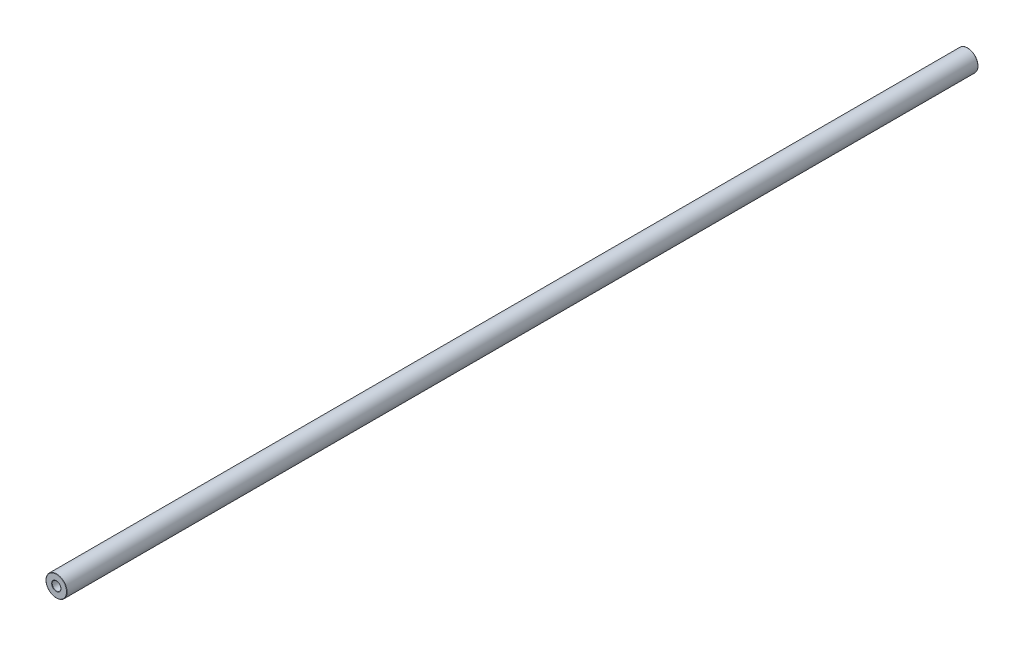
ISO-10303-21;
HEADER;
FILE_DESCRIPTION(('STEP AP214'),'2;1');
FILE_NAME('part.step','',(''),(''),'','','');
FILE_SCHEMA(('AUTOMOTIVE_DESIGN { 1 0 10303 214 1 1 1 1 }'));
ENDSEC;
DATA;
#1=APPLICATION_CONTEXT('core data for automotive mechanical design processes');
#2=APPLICATION_PROTOCOL_DEFINITION('international standard','automotive_design',2000,#1);
#3=PRODUCT_CONTEXT('',#1,'mechanical');
#4=PRODUCT('Part','Part','',(#3));
#5=PRODUCT_RELATED_PRODUCT_CATEGORY('part','',(#4));
#6=PRODUCT_DEFINITION_FORMATION('','',#4);
#7=PRODUCT_DEFINITION_CONTEXT('part definition',#1,'design');
#8=PRODUCT_DEFINITION('design','',#6,#7);
#9=PRODUCT_DEFINITION_SHAPE('','',#8);
#10=(LENGTH_UNIT() NAMED_UNIT(*) SI_UNIT(.MILLI.,.METRE.));
#11=(NAMED_UNIT(*) PLANE_ANGLE_UNIT() SI_UNIT($,.RADIAN.));
#12=(NAMED_UNIT(*) SI_UNIT($,.STERADIAN.) SOLID_ANGLE_UNIT());
#13=UNCERTAINTY_MEASURE_WITH_UNIT(LENGTH_MEASURE(1.E-05),#10,'distance_accuracy_value','');
#14=(GEOMETRIC_REPRESENTATION_CONTEXT(3) GLOBAL_UNCERTAINTY_ASSIGNED_CONTEXT((#13)) GLOBAL_UNIT_ASSIGNED_CONTEXT((#10,
#11,#12)) REPRESENTATION_CONTEXT('',''));
#15=CARTESIAN_POINT('',(0.,0.,0.));
#16=DIRECTION('',(0.,0.,1.));
#17=DIRECTION('',(1.,0.,0.));
#18=AXIS2_PLACEMENT_3D('',#15,#16,#17);
#19=CARTESIAN_POINT('',(0.,0.,260.));
#20=DIRECTION('',(0.,0.,-1.));
#21=DIRECTION('',(-1.,0.,0.));
#22=AXIS2_PLACEMENT_3D('',#19,#20,#21);
#23=CYLINDRICAL_SURFACE('',#22,3.);
#24=CARTESIAN_POINT('',(0.,0.,259.9));
#25=DIRECTION('',(0.,0.,1.));
#26=DIRECTION('',(1.,0.,0.));
#27=AXIS2_PLACEMENT_3D('',#24,#25,#26);
#28=CIRCLE('',#27,3.);
#29=CARTESIAN_POINT('',(3.,0.,259.9));
#30=VERTEX_POINT('',#29);
#31=EDGE_CURVE('E10',#30,#30,#28,.F.);
#32=ORIENTED_EDGE('',*,*,#31,.T.);
#33=EDGE_LOOP('',(#32));
#34=FACE_BOUND('',#33,.T.);
#35=CARTESIAN_POINT('',(0.,0.,0.099999999999989));
#36=DIRECTION('',(0.,0.,1.));
#37=DIRECTION('',(1.,0.,0.));
#38=AXIS2_PLACEMENT_3D('',#35,#36,#37);
#39=CIRCLE('',#38,3.);
#40=CARTESIAN_POINT('',(3.,0.,0.099999999999989));
#41=VERTEX_POINT('',#40);
#42=EDGE_CURVE('E30',#41,#41,#39,.T.);
#43=ORIENTED_EDGE('',*,*,#42,.T.);
#44=EDGE_LOOP('',(#43));
#45=FACE_BOUND('',#44,.T.);
#46=ADVANCED_FACE('F24',(#34,#45),#23,.T.);
#47=CARTESIAN_POINT('',(0.,0.,260.));
#48=DIRECTION('',(0.,0.,1.));
#49=DIRECTION('',(1.,0.,0.));
#50=AXIS2_PLACEMENT_3D('',#47,#48,#49);
#51=PLANE('',#50);
#52=CARTESIAN_POINT('',(0.,0.,260.));
#53=DIRECTION('',(0.,0.,1.));
#54=DIRECTION('',(1.,0.,0.));
#55=AXIS2_PLACEMENT_3D('',#52,#53,#54);
#56=CIRCLE('',#55,1.35);
#57=CARTESIAN_POINT('',(1.35,0.,260.));
#58=VERTEX_POINT('',#57);
#59=EDGE_CURVE('E46',#58,#58,#56,.F.);
#60=ORIENTED_EDGE('',*,*,#59,.T.);
#61=EDGE_LOOP('',(#60));
#62=FACE_BOUND('',#61,.T.);
#63=CARTESIAN_POINT('',(0.,0.,260.));
#64=DIRECTION('',(0.,0.,1.));
#65=DIRECTION('',(1.,0.,0.));
#66=AXIS2_PLACEMENT_3D('',#63,#64,#65);
#67=CIRCLE('',#66,2.9);
#68=CARTESIAN_POINT('',(2.9,0.,260.));
#69=VERTEX_POINT('',#68);
#70=EDGE_CURVE('E49',#69,#69,#67,.T.);
#71=ORIENTED_EDGE('',*,*,#70,.T.);
#72=EDGE_LOOP('',(#71));
#73=FACE_BOUND('',#72,.T.);
#74=ADVANCED_FACE('F81',(#62,#73),#51,.T.);
#75=CARTESIAN_POINT('',(0.,0.,0.));
#76=DIRECTION('',(0.,0.,1.));
#77=DIRECTION('',(1.,0.,0.));
#78=AXIS2_PLACEMENT_3D('',#75,#76,#77);
#79=PLANE('',#78);
#80=CARTESIAN_POINT('',(0.,0.,0.));
#81=DIRECTION('',(0.,0.,1.));
#82=DIRECTION('',(1.,0.,0.));
#83=AXIS2_PLACEMENT_3D('',#80,#81,#82);
#84=CIRCLE('',#83,1.35);
#85=CARTESIAN_POINT('',(1.35,0.,0.));
#86=VERTEX_POINT('',#85);
#87=EDGE_CURVE('E34',#86,#86,#84,.T.);
#88=ORIENTED_EDGE('',*,*,#87,.T.);
#89=EDGE_LOOP('',(#88));
#90=FACE_BOUND('',#89,.T.);
#91=CARTESIAN_POINT('',(0.,0.,0.));
#92=DIRECTION('',(0.,0.,1.));
#93=DIRECTION('',(1.,0.,0.));
#94=AXIS2_PLACEMENT_3D('',#91,#92,#93);
#95=CIRCLE('',#94,2.9);
#96=CARTESIAN_POINT('',(2.9,0.,0.));
#97=VERTEX_POINT('',#96);
#98=EDGE_CURVE('E38',#97,#97,#95,.F.);
#99=ORIENTED_EDGE('',*,*,#98,.T.);
#100=EDGE_LOOP('',(#99));
#101=FACE_BOUND('',#100,.T.);
#102=ADVANCED_FACE('F85',(#90,#101),#79,.F.);
#103=CARTESIAN_POINT('',(0.,0.,240.));
#104=DIRECTION('',(0.,0.,1.));
#105=DIRECTION('',(1.,0.,0.));
#106=AXIS2_PLACEMENT_3D('',#103,#104,#105);
#107=CYLINDRICAL_SURFACE('',#106,1.25);
#108=CARTESIAN_POINT('',(0.,0.,259.9));
#109=DIRECTION('',(0.,0.,1.));
#110=DIRECTION('',(1.,0.,0.));
#111=AXIS2_PLACEMENT_3D('',#108,#109,#110);
#112=CIRCLE('',#111,1.25);
#113=CARTESIAN_POINT('',(1.25,0.,259.9));
#114=VERTEX_POINT('',#113);
#115=EDGE_CURVE('E52',#114,#114,#112,.T.);
#116=ORIENTED_EDGE('',*,*,#115,.T.);
#117=EDGE_LOOP('',(#116));
#118=FACE_BOUND('',#117,.T.);
#119=CARTESIAN_POINT('',(0.,0.,240.));
#120=DIRECTION('',(0.,0.,1.));
#121=DIRECTION('',(1.,0.,0.));
#122=AXIS2_PLACEMENT_3D('',#119,#120,#121);
#123=CIRCLE('',#122,1.25);
#124=CARTESIAN_POINT('',(1.25,0.,240.));
#125=VERTEX_POINT('',#124);
#126=EDGE_CURVE('E55',#125,#125,#123,.T.);
#127=ORIENTED_EDGE('',*,*,#126,.F.);
#128=EDGE_LOOP('',(#127));
#129=FACE_BOUND('',#128,.T.);
#130=ADVANCED_FACE('F77',(#118,#129),#107,.F.);
#131=CARTESIAN_POINT('',(0.,0.,240.));
#132=DIRECTION('',(0.,0.,1.));
#133=DIRECTION('',(1.,0.,0.));
#134=AXIS2_PLACEMENT_3D('',#131,#132,#133);
#135=PLANE('',#134);
#136=ORIENTED_EDGE('',*,*,#126,.T.);
#137=EDGE_LOOP('',(#136));
#138=FACE_BOUND('',#137,.T.);
#139=ADVANCED_FACE('F66',(#138),#135,.T.);
#140=CARTESIAN_POINT('',(0.,0.,20.));
#141=DIRECTION('',(0.,0.,-1.));
#142=DIRECTION('',(-1.,0.,0.));
#143=AXIS2_PLACEMENT_3D('',#140,#141,#142);
#144=CYLINDRICAL_SURFACE('',#143,1.25);
#145=CARTESIAN_POINT('',(0.,0.,0.0999999999999994));
#146=DIRECTION('',(0.,0.,1.));
#147=DIRECTION('',(1.,0.,0.));
#148=AXIS2_PLACEMENT_3D('',#145,#146,#147);
#149=CIRCLE('',#148,1.25);
#150=CARTESIAN_POINT('',(1.25,0.,0.0999999999999994));
#151=VERTEX_POINT('',#150);
#152=EDGE_CURVE('E43',#151,#151,#149,.F.);
#153=ORIENTED_EDGE('',*,*,#152,.T.);
#154=EDGE_LOOP('',(#153));
#155=FACE_BOUND('',#154,.T.);
#156=CARTESIAN_POINT('',(0.,0.,20.));
#157=DIRECTION('',(0.,0.,-1.));
#158=DIRECTION('',(-1.,0.,0.));
#159=AXIS2_PLACEMENT_3D('',#156,#157,#158);
#160=CIRCLE('',#159,1.25);
#161=CARTESIAN_POINT('',(-1.25,0.,20.));
#162=VERTEX_POINT('',#161);
#163=EDGE_CURVE('E58',#162,#162,#160,.T.);
#164=ORIENTED_EDGE('',*,*,#163,.F.);
#165=EDGE_LOOP('',(#164));
#166=FACE_BOUND('',#165,.T.);
#167=ADVANCED_FACE('F64',(#155,#166),#144,.F.);
#168=CARTESIAN_POINT('',(0.,0.,20.));
#169=DIRECTION('',(0.,0.,-1.));
#170=DIRECTION('',(-1.,0.,0.));
#171=AXIS2_PLACEMENT_3D('',#168,#169,#170);
#172=PLANE('',#171);
#173=ORIENTED_EDGE('',*,*,#163,.T.);
#174=EDGE_LOOP('',(#173));
#175=FACE_BOUND('',#174,.T.);
#176=ADVANCED_FACE('F62',(#175),#172,.T.);
#177=CARTESIAN_POINT('',(0.,0.,259.9));
#178=DIRECTION('',(0.,0.,1.));
#179=DIRECTION('',(1.,0.,0.));
#180=AXIS2_PLACEMENT_3D('',#177,#178,#179);
#181=TOROIDAL_SURFACE('',#180,1.35,0.1);
#182=ORIENTED_EDGE('',*,*,#59,.F.);
#183=EDGE_LOOP('',(#182));
#184=FACE_BOUND('',#183,.T.);
#185=ORIENTED_EDGE('',*,*,#115,.F.);
#186=EDGE_LOOP('',(#185));
#187=FACE_BOUND('',#186,.T.);
#188=ADVANCED_FACE('F74',(#184,#187),#181,.T.);
#189=CARTESIAN_POINT('',(0.,0.,0.0999999999999994));
#190=DIRECTION('',(0.,0.,1.));
#191=DIRECTION('',(1.,0.,0.));
#192=AXIS2_PLACEMENT_3D('',#189,#190,#191);
#193=TOROIDAL_SURFACE('',#192,1.35,0.1);
#194=ORIENTED_EDGE('',*,*,#87,.F.);
#195=EDGE_LOOP('',(#194));
#196=FACE_BOUND('',#195,.T.);
#197=ORIENTED_EDGE('',*,*,#152,.F.);
#198=EDGE_LOOP('',(#197));
#199=FACE_BOUND('',#198,.T.);
#200=ADVANCED_FACE('F101',(#196,#199),#193,.T.);
#201=CARTESIAN_POINT('',(0.,0.,259.9));
#202=DIRECTION('',(0.,0.,1.));
#203=DIRECTION('',(1.,0.,0.));
#204=AXIS2_PLACEMENT_3D('',#201,#202,#203);
#205=TOROIDAL_SURFACE('',#204,2.9,0.1);
#206=ORIENTED_EDGE('',*,*,#31,.F.);
#207=EDGE_LOOP('',(#206));
#208=FACE_BOUND('',#207,.T.);
#209=ORIENTED_EDGE('',*,*,#70,.F.);
#210=EDGE_LOOP('',(#209));
#211=FACE_BOUND('',#210,.T.);
#212=ADVANCED_FACE('F107',(#208,#211),#205,.T.);
#213=CARTESIAN_POINT('',(0.,0.,0.099999999999989));
#214=DIRECTION('',(0.,0.,1.));
#215=DIRECTION('',(1.,0.,0.));
#216=AXIS2_PLACEMENT_3D('',#213,#214,#215);
#217=TOROIDAL_SURFACE('',#216,2.9,0.1);
#218=ORIENTED_EDGE('',*,*,#98,.F.);
#219=EDGE_LOOP('',(#218));
#220=FACE_BOUND('',#219,.T.);
#221=ORIENTED_EDGE('',*,*,#42,.F.);
#222=EDGE_LOOP('',(#221));
#223=FACE_BOUND('',#222,.T.);
#224=ADVANCED_FACE('F114',(#220,#223),#217,.T.);
#225=CLOSED_SHELL('',(#46,#74,#102,#130,#139,#167,#176,#188,#200,#212,#224));
#226=MANIFOLD_SOLID_BREP('B2',#225);
#227=ADVANCED_BREP_SHAPE_REPRESENTATION('',(#18,#226),#14);
#228=SHAPE_DEFINITION_REPRESENTATION(#9,#227);
ENDSEC;
END-ISO-10303-21;
